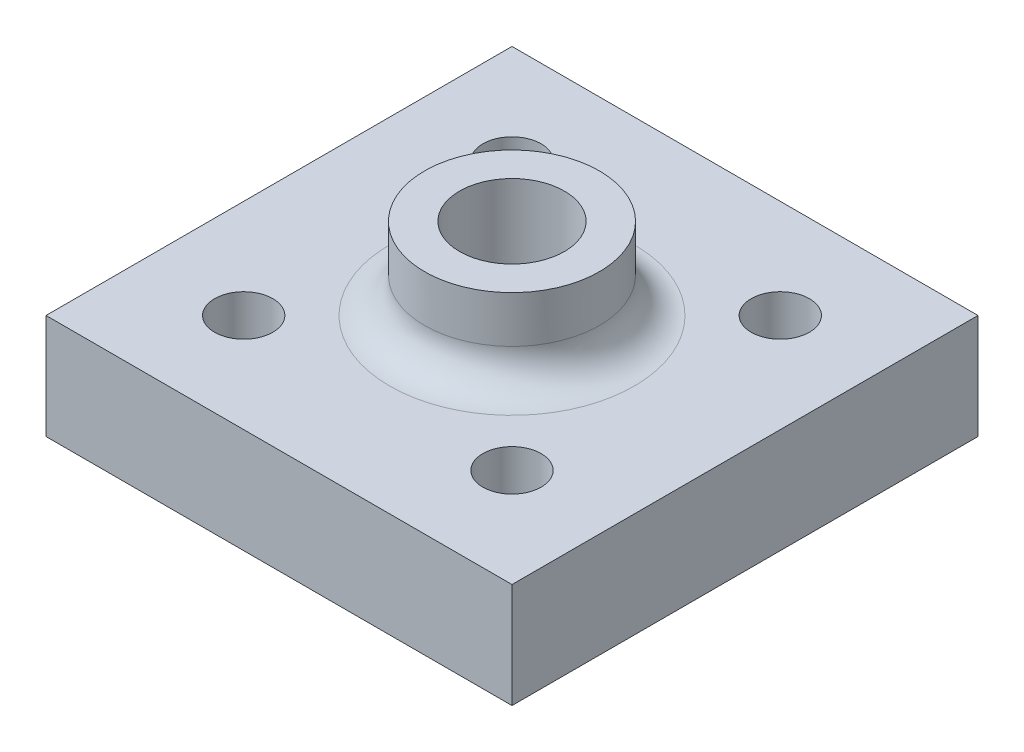
ISO-10303-21;
HEADER;
FILE_DESCRIPTION(('STEP AP214'),'2;1');
FILE_NAME('part.step','',(''),(''),'','','');
FILE_SCHEMA(('AUTOMOTIVE_DESIGN { 1 0 10303 214 1 1 1 1 }'));
ENDSEC;
DATA;
#1=APPLICATION_CONTEXT('core data for automotive mechanical design processes');
#2=APPLICATION_PROTOCOL_DEFINITION('international standard','automotive_design',2000,#1);
#3=PRODUCT_CONTEXT('',#1,'mechanical');
#4=PRODUCT('Part','Part','',(#3));
#5=PRODUCT_RELATED_PRODUCT_CATEGORY('part','',(#4));
#6=PRODUCT_DEFINITION_FORMATION('','',#4);
#7=PRODUCT_DEFINITION_CONTEXT('part definition',#1,'design');
#8=PRODUCT_DEFINITION('design','',#6,#7);
#9=PRODUCT_DEFINITION_SHAPE('','',#8);
#10=(LENGTH_UNIT() NAMED_UNIT(*) SI_UNIT(.MILLI.,.METRE.));
#11=(NAMED_UNIT(*) PLANE_ANGLE_UNIT() SI_UNIT($,.RADIAN.));
#12=(NAMED_UNIT(*) SI_UNIT($,.STERADIAN.) SOLID_ANGLE_UNIT());
#13=UNCERTAINTY_MEASURE_WITH_UNIT(LENGTH_MEASURE(1.E-05),#10,'distance_accuracy_value','');
#14=(GEOMETRIC_REPRESENTATION_CONTEXT(3) GLOBAL_UNCERTAINTY_ASSIGNED_CONTEXT((#13)) GLOBAL_UNIT_ASSIGNED_CONTEXT((#10,
#11,#12)) REPRESENTATION_CONTEXT('',''));
#15=CARTESIAN_POINT('',(0.,0.,0.));
#16=DIRECTION('',(0.,0.,1.));
#17=DIRECTION('',(1.,0.,0.));
#18=AXIS2_PLACEMENT_3D('',#15,#16,#17);
#19=CARTESIAN_POINT('',(0.,9.,0.));
#20=DIRECTION('',(0.,1.,0.));
#21=DIRECTION('',(0.,0.,1.));
#22=AXIS2_PLACEMENT_3D('',#19,#20,#21);
#23=PLANE('',#22);
#24=CARTESIAN_POINT('',(0.,9.,0.));
#25=DIRECTION('',(0.,1.,0.));
#26=DIRECTION('',(0.,0.,1.));
#27=AXIS2_PLACEMENT_3D('',#24,#25,#26);
#28=CIRCLE('',#27,10.5);
#29=CARTESIAN_POINT('',(0.,9.,10.5));
#30=VERTEX_POINT('',#29);
#31=EDGE_CURVE('E11',#30,#30,#28,.F.);
#32=ORIENTED_EDGE('',*,*,#31,.T.);
#33=EDGE_LOOP('',(#32));
#34=FACE_BOUND('',#33,.T.);
#35=DIRECTION('',(0.,0.,1.));
#36=VECTOR('',#35,1.);
#37=CARTESIAN_POINT('',(-20.,9.,-20.));
#38=LINE('',#37,#36);
#39=CARTESIAN_POINT('',(-20.,9.,-20.));
#40=VERTEX_POINT('',#39);
#41=CARTESIAN_POINT('',(-20.,9.,20.));
#42=VERTEX_POINT('',#41);
#43=EDGE_CURVE('E119',#40,#42,#38,.T.);
#44=ORIENTED_EDGE('',*,*,#43,.T.);
#45=DIRECTION('',(1.,0.,0.));
#46=VECTOR('',#45,1.);
#47=CARTESIAN_POINT('',(-20.,9.,20.));
#48=LINE('',#47,#46);
#49=CARTESIAN_POINT('',(20.,9.,20.));
#50=VERTEX_POINT('',#49);
#51=EDGE_CURVE('E126',#42,#50,#48,.T.);
#52=ORIENTED_EDGE('',*,*,#51,.T.);
#53=DIRECTION('',(0.,0.,-1.));
#54=VECTOR('',#53,1.);
#55=CARTESIAN_POINT('',(20.,9.,-20.));
#56=LINE('',#55,#54);
#57=CARTESIAN_POINT('',(20.,9.,-20.));
#58=VERTEX_POINT('',#57);
#59=EDGE_CURVE('E131',#50,#58,#56,.T.);
#60=ORIENTED_EDGE('',*,*,#59,.T.);
#61=DIRECTION('',(-1.,0.,0.));
#62=VECTOR('',#61,1.);
#63=CARTESIAN_POINT('',(-20.,9.,-20.));
#64=LINE('',#63,#62);
#65=EDGE_CURVE('E136',#58,#40,#64,.T.);
#66=ORIENTED_EDGE('',*,*,#65,.T.);
#67=EDGE_LOOP('',(#44,#52,#60,#66));
#68=FACE_BOUND('',#67,.T.);
#69=CARTESIAN_POINT('',(-11.5147186257614,9.,-11.5147186257614));
#70=DIRECTION('',(0.,1.,0.));
#71=DIRECTION('',(0.,0.,1.));
#72=AXIS2_PLACEMENT_3D('',#69,#70,#71);
#73=CIRCLE('',#72,2.5);
#74=CARTESIAN_POINT('',(-11.5147186257614,9.,-9.01471862576144));
#75=VERTEX_POINT('',#74);
#76=EDGE_CURVE('E316',#75,#75,#73,.T.);
#77=ORIENTED_EDGE('',*,*,#76,.F.);
#78=EDGE_LOOP('',(#77));
#79=FACE_BOUND('',#78,.T.);
#80=CARTESIAN_POINT('',(-11.5147186257614,9.,11.5147186257614));
#81=DIRECTION('',(0.,1.,0.));
#82=DIRECTION('',(0.,0.,1.));
#83=AXIS2_PLACEMENT_3D('',#80,#81,#82);
#84=CIRCLE('',#83,2.5);
#85=CARTESIAN_POINT('',(-11.5147186257614,9.,14.0147186257614));
#86=VERTEX_POINT('',#85);
#87=EDGE_CURVE('E296',#86,#86,#84,.T.);
#88=ORIENTED_EDGE('',*,*,#87,.F.);
#89=EDGE_LOOP('',(#88));
#90=FACE_BOUND('',#89,.T.);
#91=CARTESIAN_POINT('',(11.5147186257614,9.,11.5147186257614));
#92=DIRECTION('',(0.,1.,0.));
#93=DIRECTION('',(0.,0.,1.));
#94=AXIS2_PLACEMENT_3D('',#91,#92,#93);
#95=CIRCLE('',#94,2.5);
#96=CARTESIAN_POINT('',(11.5147186257614,9.,14.0147186257614));
#97=VERTEX_POINT('',#96);
#98=EDGE_CURVE('E303',#97,#97,#95,.T.);
#99=ORIENTED_EDGE('',*,*,#98,.F.);
#100=EDGE_LOOP('',(#99));
#101=FACE_BOUND('',#100,.T.);
#102=CARTESIAN_POINT('',(11.5147186257614,9.,-11.5147186257614));
#103=DIRECTION('',(0.,1.,0.));
#104=DIRECTION('',(0.,0.,1.));
#105=AXIS2_PLACEMENT_3D('',#102,#103,#104);
#106=CIRCLE('',#105,2.5);
#107=CARTESIAN_POINT('',(11.5147186257614,9.,-9.01471862576143));
#108=VERTEX_POINT('',#107);
#109=EDGE_CURVE('E299',#108,#108,#106,.T.);
#110=ORIENTED_EDGE('',*,*,#109,.F.);
#111=EDGE_LOOP('',(#110));
#112=FACE_BOUND('',#111,.T.);
#113=ADVANCED_FACE('F35',(#34,#68,#79,#90,#101,#112),#23,.T.);
#114=CARTESIAN_POINT('',(0.,0.,0.));
#115=DIRECTION('',(0.,1.,0.));
#116=DIRECTION('',(0.,0.,1.));
#117=AXIS2_PLACEMENT_3D('',#114,#115,#116);
#118=PLANE('',#117);
#119=CARTESIAN_POINT('',(11.5147186257614,0.,-11.5147186257614));
#120=DIRECTION('',(0.,1.,0.));
#121=DIRECTION('',(0.,0.,1.));
#122=AXIS2_PLACEMENT_3D('',#119,#120,#121);
#123=CIRCLE('',#122,2.5);
#124=CARTESIAN_POINT('',(11.5147186257614,0.,-9.01471862576143));
#125=VERTEX_POINT('',#124);
#126=EDGE_CURVE('E313',#125,#125,#123,.T.);
#127=ORIENTED_EDGE('',*,*,#126,.T.);
#128=EDGE_LOOP('',(#127));
#129=FACE_BOUND('',#128,.T.);
#130=CARTESIAN_POINT('',(11.5147186257614,0.,11.5147186257614));
#131=DIRECTION('',(0.,1.,0.));
#132=DIRECTION('',(0.,0.,1.));
#133=AXIS2_PLACEMENT_3D('',#130,#131,#132);
#134=CIRCLE('',#133,2.5);
#135=CARTESIAN_POINT('',(11.5147186257614,0.,14.0147186257614));
#136=VERTEX_POINT('',#135);
#137=EDGE_CURVE('E310',#136,#136,#134,.T.);
#138=ORIENTED_EDGE('',*,*,#137,.T.);
#139=EDGE_LOOP('',(#138));
#140=FACE_BOUND('',#139,.T.);
#141=CARTESIAN_POINT('',(-11.5147186257614,0.,11.5147186257614));
#142=DIRECTION('',(0.,1.,0.));
#143=DIRECTION('',(0.,0.,1.));
#144=AXIS2_PLACEMENT_3D('',#141,#142,#143);
#145=CIRCLE('',#144,2.5);
#146=CARTESIAN_POINT('',(-11.5147186257614,0.,14.0147186257614));
#147=VERTEX_POINT('',#146);
#148=EDGE_CURVE('E302',#147,#147,#145,.T.);
#149=ORIENTED_EDGE('',*,*,#148,.T.);
#150=EDGE_LOOP('',(#149));
#151=FACE_BOUND('',#150,.T.);
#152=CARTESIAN_POINT('',(-11.5147186257614,0.,-11.5147186257614));
#153=DIRECTION('',(0.,1.,0.));
#154=DIRECTION('',(0.,0.,1.));
#155=AXIS2_PLACEMENT_3D('',#152,#153,#154);
#156=CIRCLE('',#155,2.5);
#157=CARTESIAN_POINT('',(-11.5147186257614,0.,-9.01471862576144));
#158=VERTEX_POINT('',#157);
#159=EDGE_CURVE('E140',#158,#158,#156,.T.);
#160=ORIENTED_EDGE('',*,*,#159,.T.);
#161=EDGE_LOOP('',(#160));
#162=FACE_BOUND('',#161,.T.);
#163=DIRECTION('',(0.,0.,-1.));
#164=VECTOR('',#163,1.);
#165=CARTESIAN_POINT('',(20.,0.,-20.));
#166=LINE('',#165,#164);
#167=CARTESIAN_POINT('',(20.,0.,20.));
#168=VERTEX_POINT('',#167);
#169=CARTESIAN_POINT('',(20.,0.,-20.));
#170=VERTEX_POINT('',#169);
#171=EDGE_CURVE('E192',#168,#170,#166,.T.);
#172=ORIENTED_EDGE('',*,*,#171,.F.);
#173=DIRECTION('',(1.,0.,0.));
#174=VECTOR('',#173,1.);
#175=CARTESIAN_POINT('',(-20.,0.,20.));
#176=LINE('',#175,#174);
#177=CARTESIAN_POINT('',(-20.,0.,20.));
#178=VERTEX_POINT('',#177);
#179=EDGE_CURVE('E58',#178,#168,#176,.T.);
#180=ORIENTED_EDGE('',*,*,#179,.F.);
#181=DIRECTION('',(0.,0.,1.));
#182=VECTOR('',#181,1.);
#183=CARTESIAN_POINT('',(-20.,0.,-20.));
#184=LINE('',#183,#182);
#185=CARTESIAN_POINT('',(-20.,0.,-20.));
#186=VERTEX_POINT('',#185);
#187=EDGE_CURVE('E121',#186,#178,#184,.T.);
#188=ORIENTED_EDGE('',*,*,#187,.F.);
#189=DIRECTION('',(-1.,0.,0.));
#190=VECTOR('',#189,1.);
#191=CARTESIAN_POINT('',(-20.,0.,-20.));
#192=LINE('',#191,#190);
#193=EDGE_CURVE('E195',#170,#186,#192,.T.);
#194=ORIENTED_EDGE('',*,*,#193,.F.);
#195=EDGE_LOOP('',(#172,#180,#188,#194));
#196=FACE_BOUND('',#195,.T.);
#197=DIRECTION('',(0.5,0.,-0.866025403784439));
#198=VECTOR('',#197,1.);
#199=CARTESIAN_POINT('',(3.75277674973256,0.,6.5));
#200=LINE('',#199,#198);
#201=CARTESIAN_POINT('',(3.75277674973256,0.,6.5));
#202=VERTEX_POINT('',#201);
#203=CARTESIAN_POINT('',(7.50555349946513,0.,0.));
#204=VERTEX_POINT('',#203);
#205=EDGE_CURVE('E50',#202,#204,#200,.T.);
#206=ORIENTED_EDGE('',*,*,#205,.T.);
#207=DIRECTION('',(-0.5,0.,-0.866025403784439));
#208=VECTOR('',#207,1.);
#209=CARTESIAN_POINT('',(7.50555349946513,0.,0.));
#210=LINE('',#209,#208);
#211=CARTESIAN_POINT('',(3.75277674973256,0.,-6.5));
#212=VERTEX_POINT('',#211);
#213=EDGE_CURVE('E167',#204,#212,#210,.T.);
#214=ORIENTED_EDGE('',*,*,#213,.T.);
#215=DIRECTION('',(-1.,0.,0.));
#216=VECTOR('',#215,1.);
#217=CARTESIAN_POINT('',(3.75277674973256,0.,-6.5));
#218=LINE('',#217,#216);
#219=CARTESIAN_POINT('',(-3.75277674973257,0.,-6.5));
#220=VERTEX_POINT('',#219);
#221=EDGE_CURVE('E170',#212,#220,#218,.T.);
#222=ORIENTED_EDGE('',*,*,#221,.T.);
#223=DIRECTION('',(-0.5,0.,0.866025403784438));
#224=VECTOR('',#223,1.);
#225=CARTESIAN_POINT('',(-3.75277674973257,0.,-6.5));
#226=LINE('',#225,#224);
#227=CARTESIAN_POINT('',(-7.50555349946514,0.,0.));
#228=VERTEX_POINT('',#227);
#229=EDGE_CURVE('E173',#220,#228,#226,.T.);
#230=ORIENTED_EDGE('',*,*,#229,.T.);
#231=DIRECTION('',(0.5,0.,0.866025403784439));
#232=VECTOR('',#231,1.);
#233=CARTESIAN_POINT('',(-7.50555349946514,0.,0.));
#234=LINE('',#233,#232);
#235=CARTESIAN_POINT('',(-3.75277674973257,0.,6.5));
#236=VERTEX_POINT('',#235);
#237=EDGE_CURVE('E176',#228,#236,#234,.T.);
#238=ORIENTED_EDGE('',*,*,#237,.T.);
#239=DIRECTION('',(1.,0.,0.));
#240=VECTOR('',#239,1.);
#241=CARTESIAN_POINT('',(-3.75277674973257,0.,6.5));
#242=LINE('',#241,#240);
#243=EDGE_CURVE('E150',#236,#202,#242,.T.);
#244=ORIENTED_EDGE('',*,*,#243,.T.);
#245=EDGE_LOOP('',(#206,#214,#222,#230,#238,#244));
#246=FACE_BOUND('',#245,.T.);
#247=ADVANCED_FACE('F218',(#129,#140,#151,#162,#196,#246),#118,.F.);
#248=CARTESIAN_POINT('',(20.,6.,-20.));
#249=DIRECTION('',(-1.,0.,0.));
#250=DIRECTION('',(0.,0.,1.));
#251=AXIS2_PLACEMENT_3D('',#248,#249,#250);
#252=PLANE('',#251);
#253=ORIENTED_EDGE('',*,*,#171,.T.);
#254=DIRECTION('',(0.,-1.,0.));
#255=VECTOR('',#254,1.);
#256=CARTESIAN_POINT('',(20.,6.,-20.));
#257=LINE('',#256,#255);
#258=EDGE_CURVE('E201',#58,#170,#257,.T.);
#259=ORIENTED_EDGE('',*,*,#258,.F.);
#260=ORIENTED_EDGE('',*,*,#59,.F.);
#261=DIRECTION('',(0.,-1.,0.));
#262=VECTOR('',#261,1.);
#263=CARTESIAN_POINT('',(20.,6.,20.));
#264=LINE('',#263,#262);
#265=EDGE_CURVE('E123',#50,#168,#264,.T.);
#266=ORIENTED_EDGE('',*,*,#265,.T.);
#267=EDGE_LOOP('',(#253,#259,#260,#266));
#268=FACE_BOUND('',#267,.T.);
#269=ADVANCED_FACE('F226',(#268),#252,.F.);
#270=CARTESIAN_POINT('',(-20.,6.,-20.));
#271=DIRECTION('',(0.,0.,1.));
#272=DIRECTION('',(1.,0.,0.));
#273=AXIS2_PLACEMENT_3D('',#270,#271,#272);
#274=PLANE('',#273);
#275=ORIENTED_EDGE('',*,*,#193,.T.);
#276=DIRECTION('',(0.,-1.,0.));
#277=VECTOR('',#276,1.);
#278=CARTESIAN_POINT('',(-20.,6.,-20.));
#279=LINE('',#278,#277);
#280=EDGE_CURVE('E122',#40,#186,#279,.T.);
#281=ORIENTED_EDGE('',*,*,#280,.F.);
#282=ORIENTED_EDGE('',*,*,#65,.F.);
#283=ORIENTED_EDGE('',*,*,#258,.T.);
#284=EDGE_LOOP('',(#275,#281,#282,#283));
#285=FACE_BOUND('',#284,.T.);
#286=ADVANCED_FACE('F264',(#285),#274,.F.);
#287=CARTESIAN_POINT('',(-20.,6.,-20.));
#288=DIRECTION('',(1.,0.,0.));
#289=DIRECTION('',(0.,0.,-1.));
#290=AXIS2_PLACEMENT_3D('',#287,#288,#289);
#291=PLANE('',#290);
#292=ORIENTED_EDGE('',*,*,#187,.T.);
#293=DIRECTION('',(0.,-1.,0.));
#294=VECTOR('',#293,1.);
#295=CARTESIAN_POINT('',(-20.,6.,20.));
#296=LINE('',#295,#294);
#297=EDGE_CURVE('E114',#42,#178,#296,.T.);
#298=ORIENTED_EDGE('',*,*,#297,.F.);
#299=ORIENTED_EDGE('',*,*,#43,.F.);
#300=ORIENTED_EDGE('',*,*,#280,.T.);
#301=EDGE_LOOP('',(#292,#298,#299,#300));
#302=FACE_BOUND('',#301,.T.);
#303=ADVANCED_FACE('F116',(#302),#291,.F.);
#304=CARTESIAN_POINT('',(-20.,6.,20.));
#305=DIRECTION('',(0.,0.,-1.));
#306=DIRECTION('',(-1.,0.,0.));
#307=AXIS2_PLACEMENT_3D('',#304,#305,#306);
#308=PLANE('',#307);
#309=ORIENTED_EDGE('',*,*,#179,.T.);
#310=ORIENTED_EDGE('',*,*,#265,.F.);
#311=ORIENTED_EDGE('',*,*,#51,.F.);
#312=ORIENTED_EDGE('',*,*,#297,.T.);
#313=EDGE_LOOP('',(#309,#310,#311,#312));
#314=FACE_BOUND('',#313,.T.);
#315=ADVANCED_FACE('F127',(#314),#308,.F.);
#316=CARTESIAN_POINT('',(3.75277674973256,6.,6.5));
#317=DIRECTION('',(-0.866025403784439,0.,-0.5));
#318=DIRECTION('',(-0.5,0.,0.866025403784439));
#319=AXIS2_PLACEMENT_3D('',#316,#317,#318);
#320=PLANE('',#319);
#321=ORIENTED_EDGE('',*,*,#205,.F.);
#322=DIRECTION('',(0.,-1.,0.));
#323=VECTOR('',#322,1.);
#324=CARTESIAN_POINT('',(3.75277674973256,6.,6.5));
#325=LINE('',#324,#323);
#326=CARTESIAN_POINT('',(3.75277674973256,6.,6.5));
#327=VERTEX_POINT('',#326);
#328=EDGE_CURVE('E165',#327,#202,#325,.T.);
#329=ORIENTED_EDGE('',*,*,#328,.F.);
#330=DIRECTION('',(0.5,0.,-0.866025403784439));
#331=VECTOR('',#330,1.);
#332=CARTESIAN_POINT('',(3.75277674973256,6.,6.5));
#333=LINE('',#332,#331);
#334=CARTESIAN_POINT('',(7.50555349946513,6.,0.));
#335=VERTEX_POINT('',#334);
#336=EDGE_CURVE('E146',#327,#335,#333,.T.);
#337=ORIENTED_EDGE('',*,*,#336,.T.);
#338=DIRECTION('',(0.,-1.,0.));
#339=VECTOR('',#338,1.);
#340=CARTESIAN_POINT('',(7.50555349946513,6.,0.));
#341=LINE('',#340,#339);
#342=EDGE_CURVE('E190',#335,#204,#341,.T.);
#343=ORIENTED_EDGE('',*,*,#342,.T.);
#344=EDGE_LOOP('',(#321,#329,#337,#343));
#345=FACE_BOUND('',#344,.T.);
#346=ADVANCED_FACE('F256',(#345),#320,.T.);
#347=CARTESIAN_POINT('',(7.50555349946513,6.,0.));
#348=DIRECTION('',(-0.866025403784439,0.,0.5));
#349=DIRECTION('',(0.5,0.,0.866025403784439));
#350=AXIS2_PLACEMENT_3D('',#347,#348,#349);
#351=PLANE('',#350);
#352=ORIENTED_EDGE('',*,*,#213,.F.);
#353=ORIENTED_EDGE('',*,*,#342,.F.);
#354=DIRECTION('',(-0.5,0.,-0.866025403784439));
#355=VECTOR('',#354,1.);
#356=CARTESIAN_POINT('',(7.50555349946513,6.,0.));
#357=LINE('',#356,#355);
#358=CARTESIAN_POINT('',(3.75277674973256,6.,-6.5));
#359=VERTEX_POINT('',#358);
#360=EDGE_CURVE('E149',#335,#359,#357,.T.);
#361=ORIENTED_EDGE('',*,*,#360,.T.);
#362=DIRECTION('',(0.,-1.,0.));
#363=VECTOR('',#362,1.);
#364=CARTESIAN_POINT('',(3.75277674973256,6.,-6.5));
#365=LINE('',#364,#363);
#366=EDGE_CURVE('E188',#359,#212,#365,.T.);
#367=ORIENTED_EDGE('',*,*,#366,.T.);
#368=EDGE_LOOP('',(#352,#353,#361,#367));
#369=FACE_BOUND('',#368,.T.);
#370=ADVANCED_FACE('F252',(#369),#351,.T.);
#371=CARTESIAN_POINT('',(3.75277674973256,6.,-6.5));
#372=DIRECTION('',(0.,0.,1.));
#373=DIRECTION('',(1.,0.,0.));
#374=AXIS2_PLACEMENT_3D('',#371,#372,#373);
#375=PLANE('',#374);
#376=ORIENTED_EDGE('',*,*,#221,.F.);
#377=ORIENTED_EDGE('',*,*,#366,.F.);
#378=DIRECTION('',(-1.,0.,0.));
#379=VECTOR('',#378,1.);
#380=CARTESIAN_POINT('',(3.75277674973256,6.,-6.5));
#381=LINE('',#380,#379);
#382=CARTESIAN_POINT('',(-3.75277674973257,6.,-6.5));
#383=VERTEX_POINT('',#382);
#384=EDGE_CURVE('E153',#359,#383,#381,.T.);
#385=ORIENTED_EDGE('',*,*,#384,.T.);
#386=DIRECTION('',(0.,-1.,0.));
#387=VECTOR('',#386,1.);
#388=CARTESIAN_POINT('',(-3.75277674973257,6.,-6.5));
#389=LINE('',#388,#387);
#390=EDGE_CURVE('E186',#383,#220,#389,.T.);
#391=ORIENTED_EDGE('',*,*,#390,.T.);
#392=EDGE_LOOP('',(#376,#377,#385,#391));
#393=FACE_BOUND('',#392,.T.);
#394=ADVANCED_FACE('F248',(#393),#375,.T.);
#395=CARTESIAN_POINT('',(-3.75277674973257,6.,-6.5));
#396=DIRECTION('',(0.866025403784439,0.,0.5));
#397=DIRECTION('',(0.5,0.,-0.866025403784439));
#398=AXIS2_PLACEMENT_3D('',#395,#396,#397);
#399=PLANE('',#398);
#400=ORIENTED_EDGE('',*,*,#229,.F.);
#401=ORIENTED_EDGE('',*,*,#390,.F.);
#402=DIRECTION('',(-0.5,0.,0.866025403784438));
#403=VECTOR('',#402,1.);
#404=CARTESIAN_POINT('',(-3.75277674973257,6.,-6.5));
#405=LINE('',#404,#403);
#406=CARTESIAN_POINT('',(-7.50555349946514,6.,0.));
#407=VERTEX_POINT('',#406);
#408=EDGE_CURVE('E156',#383,#407,#405,.T.);
#409=ORIENTED_EDGE('',*,*,#408,.T.);
#410=DIRECTION('',(0.,-1.,0.));
#411=VECTOR('',#410,1.);
#412=CARTESIAN_POINT('',(-7.50555349946514,6.,0.));
#413=LINE('',#412,#411);
#414=EDGE_CURVE('E184',#407,#228,#413,.T.);
#415=ORIENTED_EDGE('',*,*,#414,.T.);
#416=EDGE_LOOP('',(#400,#401,#409,#415));
#417=FACE_BOUND('',#416,.T.);
#418=ADVANCED_FACE('F244',(#417),#399,.T.);
#419=CARTESIAN_POINT('',(-7.50555349946514,6.,0.));
#420=DIRECTION('',(0.866025403784439,0.,-0.5));
#421=DIRECTION('',(-0.5,0.,-0.866025403784439));
#422=AXIS2_PLACEMENT_3D('',#419,#420,#421);
#423=PLANE('',#422);
#424=ORIENTED_EDGE('',*,*,#237,.F.);
#425=ORIENTED_EDGE('',*,*,#414,.F.);
#426=DIRECTION('',(0.5,0.,0.866025403784439));
#427=VECTOR('',#426,1.);
#428=CARTESIAN_POINT('',(-7.50555349946514,6.,0.));
#429=LINE('',#428,#427);
#430=CARTESIAN_POINT('',(-3.75277674973257,6.,6.5));
#431=VERTEX_POINT('',#430);
#432=EDGE_CURVE('E159',#407,#431,#429,.T.);
#433=ORIENTED_EDGE('',*,*,#432,.T.);
#434=DIRECTION('',(0.,-1.,0.));
#435=VECTOR('',#434,1.);
#436=CARTESIAN_POINT('',(-3.75277674973257,6.,6.5));
#437=LINE('',#436,#435);
#438=EDGE_CURVE('E182',#431,#236,#437,.T.);
#439=ORIENTED_EDGE('',*,*,#438,.T.);
#440=EDGE_LOOP('',(#424,#425,#433,#439));
#441=FACE_BOUND('',#440,.T.);
#442=ADVANCED_FACE('F240',(#441),#423,.T.);
#443=CARTESIAN_POINT('',(-3.75277674973257,6.,6.5));
#444=DIRECTION('',(0.,0.,-1.));
#445=DIRECTION('',(-1.,0.,0.));
#446=AXIS2_PLACEMENT_3D('',#443,#444,#445);
#447=PLANE('',#446);
#448=ORIENTED_EDGE('',*,*,#243,.F.);
#449=ORIENTED_EDGE('',*,*,#438,.F.);
#450=DIRECTION('',(1.,0.,0.));
#451=VECTOR('',#450,1.);
#452=CARTESIAN_POINT('',(-3.75277674973257,6.,6.5));
#453=LINE('',#452,#451);
#454=EDGE_CURVE('E162',#431,#327,#453,.T.);
#455=ORIENTED_EDGE('',*,*,#454,.T.);
#456=ORIENTED_EDGE('',*,*,#328,.T.);
#457=EDGE_LOOP('',(#448,#449,#455,#456));
#458=FACE_BOUND('',#457,.T.);
#459=ADVANCED_FACE('F236',(#458),#447,.T.);
#460=CARTESIAN_POINT('',(0.,6.,0.));
#461=DIRECTION('',(0.,1.,0.));
#462=DIRECTION('',(0.,0.,1.));
#463=AXIS2_PLACEMENT_3D('',#460,#461,#462);
#464=PLANE('',#463);
#465=ORIENTED_EDGE('',*,*,#336,.F.);
#466=ORIENTED_EDGE('',*,*,#454,.F.);
#467=ORIENTED_EDGE('',*,*,#432,.F.);
#468=ORIENTED_EDGE('',*,*,#408,.F.);
#469=ORIENTED_EDGE('',*,*,#384,.F.);
#470=ORIENTED_EDGE('',*,*,#360,.F.);
#471=EDGE_LOOP('',(#465,#466,#467,#468,#469,#470));
#472=FACE_BOUND('',#471,.T.);
#473=CARTESIAN_POINT('',(0.,6.,0.));
#474=DIRECTION('',(0.,1.,0.));
#475=DIRECTION('',(0.,0.,1.));
#476=AXIS2_PLACEMENT_3D('',#473,#474,#475);
#477=CIRCLE('',#476,4.5);
#478=CARTESIAN_POINT('',(0.,6.,4.5));
#479=VERTEX_POINT('',#478);
#480=EDGE_CURVE('E137',#479,#479,#477,.T.);
#481=ORIENTED_EDGE('',*,*,#480,.T.);
#482=EDGE_LOOP('',(#481));
#483=FACE_BOUND('',#482,.T.);
#484=ADVANCED_FACE('F233',(#472,#483),#464,.F.);
#485=CARTESIAN_POINT('',(0.,9.,0.));
#486=DIRECTION('',(0.,-1.,0.));
#487=DIRECTION('',(0.,0.,-1.));
#488=AXIS2_PLACEMENT_3D('',#485,#486,#487);
#489=CYLINDRICAL_SURFACE('',#488,4.5);
#490=ORIENTED_EDGE('',*,*,#480,.F.);
#491=EDGE_LOOP('',(#490));
#492=FACE_BOUND('',#491,.T.);
#493=CARTESIAN_POINT('',(0.,16.,0.));
#494=DIRECTION('',(0.,1.,0.));
#495=DIRECTION('',(0.,0.,1.));
#496=AXIS2_PLACEMENT_3D('',#493,#494,#495);
#497=CIRCLE('',#496,4.5);
#498=CARTESIAN_POINT('',(0.,16.,4.5));
#499=VERTEX_POINT('',#498);
#500=EDGE_CURVE('E291',#499,#499,#497,.T.);
#501=ORIENTED_EDGE('',*,*,#500,.T.);
#502=EDGE_LOOP('',(#501));
#503=FACE_BOUND('',#502,.T.);
#504=ADVANCED_FACE('F231',(#492,#503),#489,.F.);
#505=CARTESIAN_POINT('',(-11.5147186257614,-15.,-11.5147186257614));
#506=DIRECTION('',(0.,1.,0.));
#507=DIRECTION('',(0.,0.,1.));
#508=AXIS2_PLACEMENT_3D('',#505,#506,#507);
#509=CYLINDRICAL_SURFACE('',#508,2.5);
#510=ORIENTED_EDGE('',*,*,#76,.T.);
#511=EDGE_LOOP('',(#510));
#512=FACE_BOUND('',#511,.T.);
#513=ORIENTED_EDGE('',*,*,#159,.F.);
#514=EDGE_LOOP('',(#513));
#515=FACE_BOUND('',#514,.T.);
#516=ADVANCED_FACE('F288',(#512,#515),#509,.F.);
#517=CARTESIAN_POINT('',(-11.5147186257614,-15.,11.5147186257614));
#518=DIRECTION('',(0.,1.,0.));
#519=DIRECTION('',(0.,0.,1.));
#520=AXIS2_PLACEMENT_3D('',#517,#518,#519);
#521=CYLINDRICAL_SURFACE('',#520,2.5);
#522=ORIENTED_EDGE('',*,*,#87,.T.);
#523=EDGE_LOOP('',(#522));
#524=FACE_BOUND('',#523,.T.);
#525=ORIENTED_EDGE('',*,*,#148,.F.);
#526=EDGE_LOOP('',(#525));
#527=FACE_BOUND('',#526,.T.);
#528=ADVANCED_FACE('F323',(#524,#527),#521,.F.);
#529=CARTESIAN_POINT('',(11.5147186257614,-15.,11.5147186257614));
#530=DIRECTION('',(0.,1.,0.));
#531=DIRECTION('',(0.,0.,1.));
#532=AXIS2_PLACEMENT_3D('',#529,#530,#531);
#533=CYLINDRICAL_SURFACE('',#532,2.5);
#534=ORIENTED_EDGE('',*,*,#98,.T.);
#535=EDGE_LOOP('',(#534));
#536=FACE_BOUND('',#535,.T.);
#537=ORIENTED_EDGE('',*,*,#137,.F.);
#538=EDGE_LOOP('',(#537));
#539=FACE_BOUND('',#538,.T.);
#540=ADVANCED_FACE('F328',(#536,#539),#533,.F.);
#541=CARTESIAN_POINT('',(11.5147186257614,-15.,-11.5147186257614));
#542=DIRECTION('',(0.,1.,0.));
#543=DIRECTION('',(0.,0.,1.));
#544=AXIS2_PLACEMENT_3D('',#541,#542,#543);
#545=CYLINDRICAL_SURFACE('',#544,2.5);
#546=ORIENTED_EDGE('',*,*,#109,.T.);
#547=EDGE_LOOP('',(#546));
#548=FACE_BOUND('',#547,.T.);
#549=ORIENTED_EDGE('',*,*,#126,.F.);
#550=EDGE_LOOP('',(#549));
#551=FACE_BOUND('',#550,.T.);
#552=ADVANCED_FACE('F334',(#548,#551),#545,.F.);
#553=CARTESIAN_POINT('',(0.,16.,0.));
#554=DIRECTION('',(0.,1.,0.));
#555=DIRECTION('',(0.,0.,1.));
#556=AXIS2_PLACEMENT_3D('',#553,#554,#555);
#557=PLANE('',#556);
#558=CARTESIAN_POINT('',(0.,16.,0.));
#559=DIRECTION('',(0.,1.,0.));
#560=DIRECTION('',(0.,0.,1.));
#561=AXIS2_PLACEMENT_3D('',#558,#559,#560);
#562=CIRCLE('',#561,7.5);
#563=CARTESIAN_POINT('',(0.,16.,-7.5));
#564=VERTEX_POINT('',#563);
#565=EDGE_CURVE('E293',#564,#564,#562,.T.);
#566=ORIENTED_EDGE('',*,*,#565,.T.);
#567=EDGE_LOOP('',(#566));
#568=FACE_BOUND('',#567,.T.);
#569=ORIENTED_EDGE('',*,*,#500,.F.);
#570=EDGE_LOOP('',(#569));
#571=FACE_BOUND('',#570,.T.);
#572=ADVANCED_FACE('F214',(#568,#571),#557,.T.);
#573=CARTESIAN_POINT('',(0.,16.,0.));
#574=DIRECTION('',(0.,-1.,0.));
#575=DIRECTION('',(0.,0.,-1.));
#576=AXIS2_PLACEMENT_3D('',#573,#574,#575);
#577=CYLINDRICAL_SURFACE('',#576,7.5);
#578=CARTESIAN_POINT('',(0.,12.,0.));
#579=DIRECTION('',(0.,1.,0.));
#580=DIRECTION('',(0.,0.,1.));
#581=AXIS2_PLACEMENT_3D('',#578,#579,#580);
#582=CIRCLE('',#581,7.5);
#583=CARTESIAN_POINT('',(0.,12.,-7.5));
#584=VERTEX_POINT('',#583);
#585=EDGE_CURVE('E43',#584,#584,#582,.T.);
#586=CARTESIAN_POINT('',(0.,12.,-7.5));
#587=CARTESIAN_POINT('',(0.,12.0416666666667,-7.5));
#588=CARTESIAN_POINT('',(0.,12.0833333333333,-7.5));
#589=CARTESIAN_POINT('',(0.,12.1666666666667,-7.5));
#590=CARTESIAN_POINT('',(0.,12.2083333333333,-7.5));
#591=CARTESIAN_POINT('',(0.,12.2916666666667,-7.5));
#592=CARTESIAN_POINT('',(0.,12.3333333333333,-7.5));
#593=CARTESIAN_POINT('',(0.,12.4166666666667,-7.5));
#594=CARTESIAN_POINT('',(0.,12.4583333333333,-7.5));
#595=CARTESIAN_POINT('',(0.,12.5416666666667,-7.5));
#596=CARTESIAN_POINT('',(0.,12.5833333333333,-7.5));
#597=CARTESIAN_POINT('',(0.,12.6666666666667,-7.5));
#598=CARTESIAN_POINT('',(0.,12.7083333333333,-7.5));
#599=CARTESIAN_POINT('',(0.,12.7916666666667,-7.5));
#600=CARTESIAN_POINT('',(0.,12.8333333333333,-7.5));
#601=CARTESIAN_POINT('',(0.,12.9166666666667,-7.5));
#602=CARTESIAN_POINT('',(0.,12.9583333333333,-7.5));
#603=CARTESIAN_POINT('',(0.,13.0416666666667,-7.5));
#604=CARTESIAN_POINT('',(0.,13.0833333333333,-7.5));
#605=CARTESIAN_POINT('',(0.,13.1666666666667,-7.5));
#606=CARTESIAN_POINT('',(0.,13.2083333333333,-7.5));
#607=CARTESIAN_POINT('',(0.,13.2916666666667,-7.5));
#608=CARTESIAN_POINT('',(0.,13.3333333333333,-7.5));
#609=CARTESIAN_POINT('',(0.,13.4166666666667,-7.5));
#610=CARTESIAN_POINT('',(0.,13.4583333333333,-7.5));
#611=CARTESIAN_POINT('',(0.,13.5416666666667,-7.5));
#612=CARTESIAN_POINT('',(0.,13.5833333333333,-7.5));
#613=CARTESIAN_POINT('',(0.,13.6666666666667,-7.5));
#614=CARTESIAN_POINT('',(0.,13.7083333333333,-7.5));
#615=CARTESIAN_POINT('',(0.,13.7916666666667,-7.5));
#616=CARTESIAN_POINT('',(0.,13.8333333333333,-7.5));
#617=CARTESIAN_POINT('',(0.,13.9166666666667,-7.5));
#618=CARTESIAN_POINT('',(0.,13.9583333333333,-7.5));
#619=CARTESIAN_POINT('',(0.,14.0416666666667,-7.5));
#620=CARTESIAN_POINT('',(0.,14.0833333333333,-7.5));
#621=CARTESIAN_POINT('',(0.,14.1666666666667,-7.5));
#622=CARTESIAN_POINT('',(0.,14.2083333333333,-7.5));
#623=CARTESIAN_POINT('',(0.,14.2916666666667,-7.5));
#624=CARTESIAN_POINT('',(0.,14.3333333333333,-7.5));
#625=CARTESIAN_POINT('',(0.,14.4166666666667,-7.5));
#626=CARTESIAN_POINT('',(0.,14.4583333333333,-7.5));
#627=CARTESIAN_POINT('',(0.,14.5416666666667,-7.5));
#628=CARTESIAN_POINT('',(0.,14.5833333333333,-7.5));
#629=CARTESIAN_POINT('',(0.,14.6666666666667,-7.5));
#630=CARTESIAN_POINT('',(0.,14.7083333333333,-7.5));
#631=CARTESIAN_POINT('',(0.,14.7916666666667,-7.5));
#632=CARTESIAN_POINT('',(0.,14.8333333333333,-7.5));
#633=CARTESIAN_POINT('',(0.,14.9166666666667,-7.5));
#634=CARTESIAN_POINT('',(0.,14.9583333333333,-7.5));
#635=CARTESIAN_POINT('',(0.,15.0416666666667,-7.5));
#636=CARTESIAN_POINT('',(0.,15.0833333333333,-7.5));
#637=CARTESIAN_POINT('',(0.,15.1666666666667,-7.5));
#638=CARTESIAN_POINT('',(0.,15.2083333333333,-7.5));
#639=CARTESIAN_POINT('',(0.,15.2916666666667,-7.5));
#640=CARTESIAN_POINT('',(0.,15.3333333333333,-7.5));
#641=CARTESIAN_POINT('',(0.,15.4166666666667,-7.5));
#642=CARTESIAN_POINT('',(0.,15.4583333333333,-7.5));
#643=CARTESIAN_POINT('',(0.,15.5416666666667,-7.5));
#644=CARTESIAN_POINT('',(0.,15.5833333333333,-7.5));
#645=CARTESIAN_POINT('',(0.,15.6666666666667,-7.5));
#646=CARTESIAN_POINT('',(0.,15.7083333333333,-7.5));
#647=CARTESIAN_POINT('',(0.,15.7916666666667,-7.5));
#648=CARTESIAN_POINT('',(0.,15.8333333333333,-7.5));
#649=CARTESIAN_POINT('',(0.,15.9166666666667,-7.5));
#650=CARTESIAN_POINT('',(0.,15.9583333333333,-7.5));
#651=CARTESIAN_POINT('',(0.,16.,-7.5));
#652=B_SPLINE_CURVE_WITH_KNOTS('',3,(#586,#587,#588,#589,#590,#591,#592,#593,#594,#595,#596,
#597,#598,#599,#600,#601,#602,#603,#604,#605,#606,#607,#608,#609,#610,#611,#612,#613,#614,#615,
#616,#617,#618,#619,#620,#621,#622,#623,#624,#625,#626,#627,#628,#629,#630,#631,#632,#633,#634,
#635,#636,#637,#638,#639,#640,#641,#642,#643,#644,#645,#646,#647,#648,#649,#650,#651),
.UNSPECIFIED.,.F.,.F.,(4,2,2,2,2,2,2,2,2,2,2,2,2,2,2,2,2,2,2,2,2,2,2,2,2,2,2,2,2,2,2,2,4),(0.,
0.124999999999998,0.249999999999999,0.374999999999999,0.499999999999999,0.624999999999999,
0.749999999999999,0.874999999999999,0.999999999999999,1.125,1.25,1.375,1.5,1.625,1.75,1.875,2.,
2.125,2.25,2.375,2.5,2.625,2.75,2.875,3.,3.125,3.25,3.375,3.5,3.625,3.75,3.875,4.),.UNSPECIFIED.);
#653=EDGE_CURVE('BSEAM206',#584,#564,#652,.T.);
#654=ORIENTED_EDGE('',*,*,#585,.T.);
#655=ORIENTED_EDGE('',*,*,#565,.F.);
#656=ORIENTED_EDGE('',*,*,#653,.T.);
#657=ORIENTED_EDGE('',*,*,#653,.F.);
#658=EDGE_LOOP('',(#654,#656,#655,#657));
#659=FACE_BOUND('',#658,.T.);
#660=ADVANCED_FACE('F206',(#659),#577,.T.);
#661=CARTESIAN_POINT('',(0.,12.,0.));
#662=DIRECTION('',(0.,1.,0.));
#663=DIRECTION('',(0.,0.,1.));
#664=AXIS2_PLACEMENT_3D('',#661,#662,#663);
#665=TOROIDAL_SURFACE('',#664,10.5,3.);
#666=ORIENTED_EDGE('',*,*,#31,.F.);
#667=EDGE_LOOP('',(#666));
#668=FACE_BOUND('',#667,.T.);
#669=ORIENTED_EDGE('',*,*,#585,.F.);
#670=EDGE_LOOP('',(#669));
#671=FACE_BOUND('',#670,.T.);
#672=ADVANCED_FACE('F37',(#668,#671),#665,.F.);
#673=CLOSED_SHELL('',(#113,#247,#269,#286,#303,#315,#346,#370,#394,#418,#442,#459,#484,#504,
#516,#528,#540,#552,#572,#660,#672));
#674=MANIFOLD_SOLID_BREP('B2',#673);
#675=ADVANCED_BREP_SHAPE_REPRESENTATION('',(#18,#674),#14);
#676=SHAPE_DEFINITION_REPRESENTATION(#9,#675);
ENDSEC;
END-ISO-10303-21;
